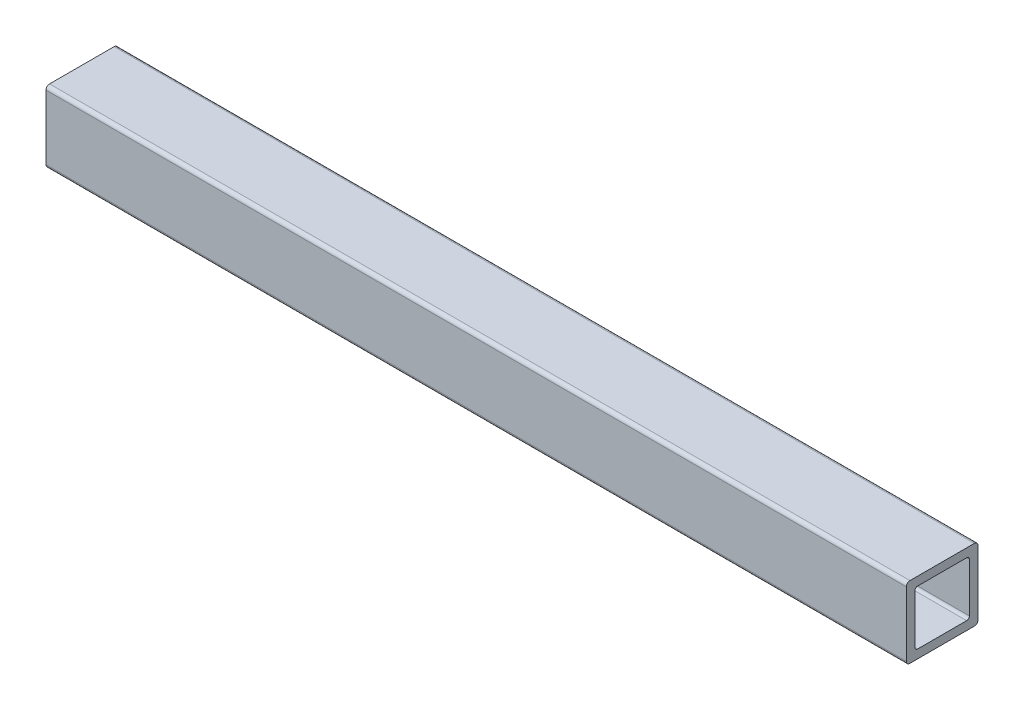
ISO-10303-21;
HEADER;
FILE_DESCRIPTION(('STEP AP214'),'2;1');
FILE_NAME('part.step','',(''),(''),'','','');
FILE_SCHEMA(('AUTOMOTIVE_DESIGN { 1 0 10303 214 1 1 1 1 }'));
ENDSEC;
DATA;
#1=APPLICATION_CONTEXT('core data for automotive mechanical design processes');
#2=APPLICATION_PROTOCOL_DEFINITION('international standard','automotive_design',2000,#1);
#3=PRODUCT_CONTEXT('',#1,'mechanical');
#4=PRODUCT('Part','Part','',(#3));
#5=PRODUCT_RELATED_PRODUCT_CATEGORY('part','',(#4));
#6=PRODUCT_DEFINITION_FORMATION('','',#4);
#7=PRODUCT_DEFINITION_CONTEXT('part definition',#1,'design');
#8=PRODUCT_DEFINITION('design','',#6,#7);
#9=PRODUCT_DEFINITION_SHAPE('','',#8);
#10=(LENGTH_UNIT() NAMED_UNIT(*) SI_UNIT(.MILLI.,.METRE.));
#11=(NAMED_UNIT(*) PLANE_ANGLE_UNIT() SI_UNIT($,.RADIAN.));
#12=(NAMED_UNIT(*) SI_UNIT($,.STERADIAN.) SOLID_ANGLE_UNIT());
#13=UNCERTAINTY_MEASURE_WITH_UNIT(LENGTH_MEASURE(1.E-05),#10,'distance_accuracy_value','');
#14=(GEOMETRIC_REPRESENTATION_CONTEXT(3) GLOBAL_UNCERTAINTY_ASSIGNED_CONTEXT((#13)) GLOBAL_UNIT_ASSIGNED_CONTEXT((#10,
#11,#12)) REPRESENTATION_CONTEXT('',''));
#15=CARTESIAN_POINT('',(0.,0.,0.));
#16=DIRECTION('',(0.,0.,1.));
#17=DIRECTION('',(1.,0.,0.));
#18=AXIS2_PLACEMENT_3D('',#15,#16,#17);
#19=CARTESIAN_POINT('',(152.4,-11.43,-11.43));
#20=DIRECTION('',(1.,0.,0.));
#21=DIRECTION('',(0.,0.,-1.));
#22=AXIS2_PLACEMENT_3D('',#19,#20,#21);
#23=PLANE('',#22);
#24=CARTESIAN_POINT('',(152.4,-11.43,-11.43));
#25=DIRECTION('',(1.,0.,0.));
#26=DIRECTION('',(0.,0.,-1.));
#27=AXIS2_PLACEMENT_3D('',#24,#25,#26);
#28=CIRCLE('',#27,1.27);
#29=CARTESIAN_POINT('',(152.4,-12.7,-11.43));
#30=VERTEX_POINT('',#29);
#31=CARTESIAN_POINT('',(152.4,-11.43,-12.7));
#32=VERTEX_POINT('',#31);
#33=EDGE_CURVE('E167',#30,#32,#28,.T.);
#34=ORIENTED_EDGE('',*,*,#33,.T.);
#35=DIRECTION('',(0.,1.,0.));
#36=VECTOR('',#35,1.);
#37=CARTESIAN_POINT('',(152.4,-11.43,-12.7));
#38=LINE('',#37,#36);
#39=CARTESIAN_POINT('',(152.4,11.43,-12.7));
#40=VERTEX_POINT('',#39);
#41=EDGE_CURVE('E282',#32,#40,#38,.T.);
#42=ORIENTED_EDGE('',*,*,#41,.T.);
#43=CARTESIAN_POINT('',(152.4,11.43,-11.43));
#44=DIRECTION('',(1.,0.,0.));
#45=DIRECTION('',(0.,0.,-1.));
#46=AXIS2_PLACEMENT_3D('',#43,#44,#45);
#47=CIRCLE('',#46,1.27);
#48=CARTESIAN_POINT('',(152.4,12.7,-11.43));
#49=VERTEX_POINT('',#48);
#50=EDGE_CURVE('E285',#40,#49,#47,.T.);
#51=ORIENTED_EDGE('',*,*,#50,.T.);
#52=DIRECTION('',(0.,0.,1.));
#53=VECTOR('',#52,1.);
#54=CARTESIAN_POINT('',(152.4,12.7,-11.43));
#55=LINE('',#54,#53);
#56=CARTESIAN_POINT('',(152.4,12.7,11.43));
#57=VERTEX_POINT('',#56);
#58=EDGE_CURVE('E288',#49,#57,#55,.T.);
#59=ORIENTED_EDGE('',*,*,#58,.T.);
#60=CARTESIAN_POINT('',(152.4,11.43,11.43));
#61=DIRECTION('',(1.,0.,0.));
#62=DIRECTION('',(0.,0.,-1.));
#63=AXIS2_PLACEMENT_3D('',#60,#61,#62);
#64=CIRCLE('',#63,1.27);
#65=CARTESIAN_POINT('',(152.4,11.43,12.7));
#66=VERTEX_POINT('',#65);
#67=EDGE_CURVE('E291',#57,#66,#64,.T.);
#68=ORIENTED_EDGE('',*,*,#67,.T.);
#69=DIRECTION('',(0.,-1.,0.));
#70=VECTOR('',#69,1.);
#71=CARTESIAN_POINT('',(152.4,-11.43,12.7));
#72=LINE('',#71,#70);
#73=CARTESIAN_POINT('',(152.4,-11.43,12.7));
#74=VERTEX_POINT('',#73);
#75=EDGE_CURVE('E294',#66,#74,#72,.T.);
#76=ORIENTED_EDGE('',*,*,#75,.T.);
#77=CARTESIAN_POINT('',(152.4,-11.43,11.43));
#78=DIRECTION('',(1.,0.,0.));
#79=DIRECTION('',(0.,0.,-1.));
#80=AXIS2_PLACEMENT_3D('',#77,#78,#79);
#81=CIRCLE('',#80,1.27);
#82=CARTESIAN_POINT('',(152.4,-12.7,11.43));
#83=VERTEX_POINT('',#82);
#84=EDGE_CURVE('E297',#74,#83,#81,.T.);
#85=ORIENTED_EDGE('',*,*,#84,.T.);
#86=DIRECTION('',(0.,0.,-1.));
#87=VECTOR('',#86,1.);
#88=CARTESIAN_POINT('',(152.4,-12.7,-11.43));
#89=LINE('',#88,#87);
#90=EDGE_CURVE('E65',#83,#30,#89,.T.);
#91=ORIENTED_EDGE('',*,*,#90,.T.);
#92=EDGE_LOOP('',(#34,#42,#51,#59,#68,#76,#85,#91));
#93=FACE_BOUND('',#92,.T.);
#94=DIRECTION('',(0.,0.,1.));
#95=VECTOR('',#94,1.);
#96=CARTESIAN_POINT('',(152.4,9.652,-8.6868));
#97=LINE('',#96,#95);
#98=CARTESIAN_POINT('',(152.4,9.652,-8.6868));
#99=VERTEX_POINT('',#98);
#100=CARTESIAN_POINT('',(152.4,9.652,8.6868));
#101=VERTEX_POINT('',#100);
#102=EDGE_CURVE('E240',#99,#101,#97,.T.);
#103=ORIENTED_EDGE('',*,*,#102,.F.);
#104=CARTESIAN_POINT('',(152.4,8.6868,-8.68679999999999));
#105=DIRECTION('',(1.,0.,0.));
#106=DIRECTION('',(0.,0.,-1.));
#107=AXIS2_PLACEMENT_3D('',#104,#105,#106);
#108=CIRCLE('',#107,0.9652);
#109=CARTESIAN_POINT('',(152.4,8.6868,-9.652));
#110=VERTEX_POINT('',#109);
#111=EDGE_CURVE('E163',#110,#99,#108,.T.);
#112=ORIENTED_EDGE('',*,*,#111,.F.);
#113=DIRECTION('',(0.,1.,0.));
#114=VECTOR('',#113,1.);
#115=CARTESIAN_POINT('',(152.4,8.6868,-9.652));
#116=LINE('',#115,#114);
#117=CARTESIAN_POINT('',(152.4,-8.6868,-9.652));
#118=VERTEX_POINT('',#117);
#119=EDGE_CURVE('E258',#118,#110,#116,.T.);
#120=ORIENTED_EDGE('',*,*,#119,.F.);
#121=CARTESIAN_POINT('',(152.4,-8.6868,-8.6868));
#122=DIRECTION('',(1.,0.,0.));
#123=DIRECTION('',(0.,0.,-1.));
#124=AXIS2_PLACEMENT_3D('',#121,#122,#123);
#125=CIRCLE('',#124,0.965199999999998);
#126=CARTESIAN_POINT('',(152.4,-9.652,-8.6868));
#127=VERTEX_POINT('',#126);
#128=EDGE_CURVE('E255',#127,#118,#125,.T.);
#129=ORIENTED_EDGE('',*,*,#128,.F.);
#130=DIRECTION('',(0.,0.,-1.));
#131=VECTOR('',#130,1.);
#132=CARTESIAN_POINT('',(152.4,-9.652,-8.6868));
#133=LINE('',#132,#131);
#134=CARTESIAN_POINT('',(152.4,-9.652,8.6868));
#135=VERTEX_POINT('',#134);
#136=EDGE_CURVE('E252',#135,#127,#133,.T.);
#137=ORIENTED_EDGE('',*,*,#136,.F.);
#138=CARTESIAN_POINT('',(152.4,-8.6868,8.68679999999999));
#139=DIRECTION('',(1.,0.,0.));
#140=DIRECTION('',(0.,0.,-1.));
#141=AXIS2_PLACEMENT_3D('',#138,#139,#140);
#142=CIRCLE('',#141,0.965200000000002);
#143=CARTESIAN_POINT('',(152.4,-8.6868,9.652));
#144=VERTEX_POINT('',#143);
#145=EDGE_CURVE('E249',#144,#135,#142,.T.);
#146=ORIENTED_EDGE('',*,*,#145,.F.);
#147=DIRECTION('',(0.,-1.,0.));
#148=VECTOR('',#147,1.);
#149=CARTESIAN_POINT('',(152.4,8.6868,9.652));
#150=LINE('',#149,#148);
#151=CARTESIAN_POINT('',(152.4,8.6868,9.652));
#152=VERTEX_POINT('',#151);
#153=EDGE_CURVE('E246',#152,#144,#150,.T.);
#154=ORIENTED_EDGE('',*,*,#153,.F.);
#155=CARTESIAN_POINT('',(152.4,8.6868,8.6868));
#156=DIRECTION('',(1.,0.,0.));
#157=DIRECTION('',(0.,0.,-1.));
#158=AXIS2_PLACEMENT_3D('',#155,#156,#157);
#159=CIRCLE('',#158,0.9652);
#160=EDGE_CURVE('E243',#101,#152,#159,.T.);
#161=ORIENTED_EDGE('',*,*,#160,.F.);
#162=EDGE_LOOP('',(#103,#112,#120,#129,#137,#146,#154,#161));
#163=FACE_BOUND('',#162,.T.);
#164=ADVANCED_FACE('F41',(#93,#163),#23,.T.);
#165=CARTESIAN_POINT('',(152.4,-11.43,-11.43));
#166=DIRECTION('',(-1.,0.,0.));
#167=DIRECTION('',(0.,0.,1.));
#168=AXIS2_PLACEMENT_3D('',#165,#166,#167);
#169=CYLINDRICAL_SURFACE('',#168,1.27);
#170=DIRECTION('',(-1.,0.,0.));
#171=VECTOR('',#170,1.);
#172=CARTESIAN_POINT('',(152.4,-12.7,-11.43));
#173=LINE('',#172,#171);
#174=CARTESIAN_POINT('',(-152.4,-12.7,-11.43));
#175=VERTEX_POINT('',#174);
#176=EDGE_CURVE('E302',#30,#175,#173,.T.);
#177=ORIENTED_EDGE('',*,*,#176,.T.);
#178=CARTESIAN_POINT('',(-152.4,-11.43,-11.43));
#179=DIRECTION('',(1.,0.,0.));
#180=DIRECTION('',(0.,0.,-1.));
#181=AXIS2_PLACEMENT_3D('',#178,#179,#180);
#182=CIRCLE('',#181,1.27);
#183=CARTESIAN_POINT('',(-152.4,-11.43,-12.7));
#184=VERTEX_POINT('',#183);
#185=EDGE_CURVE('E206',#175,#184,#182,.T.);
#186=ORIENTED_EDGE('',*,*,#185,.T.);
#187=DIRECTION('',(-1.,0.,0.));
#188=VECTOR('',#187,1.);
#189=CARTESIAN_POINT('',(152.4,-11.43,-12.7));
#190=LINE('',#189,#188);
#191=EDGE_CURVE('E11',#32,#184,#190,.T.);
#192=ORIENTED_EDGE('',*,*,#191,.F.);
#193=ORIENTED_EDGE('',*,*,#33,.F.);
#194=EDGE_LOOP('',(#177,#186,#192,#193));
#195=FACE_BOUND('',#194,.T.);
#196=ADVANCED_FACE('F43',(#195),#169,.T.);
#197=CARTESIAN_POINT('',(152.4,-11.43,-12.7));
#198=DIRECTION('',(0.,0.,1.));
#199=DIRECTION('',(1.,0.,0.));
#200=AXIS2_PLACEMENT_3D('',#197,#198,#199);
#201=PLANE('',#200);
#202=ORIENTED_EDGE('',*,*,#191,.T.);
#203=DIRECTION('',(0.,1.,0.));
#204=VECTOR('',#203,1.);
#205=CARTESIAN_POINT('',(-152.4,-11.43,-12.7));
#206=LINE('',#205,#204);
#207=CARTESIAN_POINT('',(-152.4,11.43,-12.7));
#208=VERTEX_POINT('',#207);
#209=EDGE_CURVE('E210',#184,#208,#206,.T.);
#210=ORIENTED_EDGE('',*,*,#209,.T.);
#211=DIRECTION('',(-1.,0.,0.));
#212=VECTOR('',#211,1.);
#213=CARTESIAN_POINT('',(152.4,11.43,-12.7));
#214=LINE('',#213,#212);
#215=EDGE_CURVE('E50',#40,#208,#214,.T.);
#216=ORIENTED_EDGE('',*,*,#215,.F.);
#217=ORIENTED_EDGE('',*,*,#41,.F.);
#218=EDGE_LOOP('',(#202,#210,#216,#217));
#219=FACE_BOUND('',#218,.T.);
#220=ADVANCED_FACE('F331',(#219),#201,.F.);
#221=CARTESIAN_POINT('',(152.4,11.43,-11.43));
#222=DIRECTION('',(-1.,0.,0.));
#223=DIRECTION('',(0.,0.,1.));
#224=AXIS2_PLACEMENT_3D('',#221,#222,#223);
#225=CYLINDRICAL_SURFACE('',#224,1.27);
#226=ORIENTED_EDGE('',*,*,#215,.T.);
#227=CARTESIAN_POINT('',(-152.4,11.43,-11.43));
#228=DIRECTION('',(1.,0.,0.));
#229=DIRECTION('',(0.,0.,-1.));
#230=AXIS2_PLACEMENT_3D('',#227,#228,#229);
#231=CIRCLE('',#230,1.27);
#232=CARTESIAN_POINT('',(-152.4,12.7,-11.43));
#233=VERTEX_POINT('',#232);
#234=EDGE_CURVE('E214',#208,#233,#231,.T.);
#235=ORIENTED_EDGE('',*,*,#234,.T.);
#236=DIRECTION('',(-1.,0.,0.));
#237=VECTOR('',#236,1.);
#238=CARTESIAN_POINT('',(152.4,12.7,-11.43));
#239=LINE('',#238,#237);
#240=EDGE_CURVE('E317',#49,#233,#239,.T.);
#241=ORIENTED_EDGE('',*,*,#240,.F.);
#242=ORIENTED_EDGE('',*,*,#50,.F.);
#243=EDGE_LOOP('',(#226,#235,#241,#242));
#244=FACE_BOUND('',#243,.T.);
#245=ADVANCED_FACE('F324',(#244),#225,.T.);
#246=CARTESIAN_POINT('',(152.4,12.7,-11.43));
#247=DIRECTION('',(0.,-1.,0.));
#248=DIRECTION('',(0.,0.,-1.));
#249=AXIS2_PLACEMENT_3D('',#246,#247,#248);
#250=PLANE('',#249);
#251=ORIENTED_EDGE('',*,*,#240,.T.);
#252=DIRECTION('',(0.,0.,1.));
#253=VECTOR('',#252,1.);
#254=CARTESIAN_POINT('',(-152.4,12.7,-11.43));
#255=LINE('',#254,#253);
#256=CARTESIAN_POINT('',(-152.4,12.7,11.43));
#257=VERTEX_POINT('',#256);
#258=EDGE_CURVE('E218',#233,#257,#255,.T.);
#259=ORIENTED_EDGE('',*,*,#258,.T.);
#260=DIRECTION('',(-1.,0.,0.));
#261=VECTOR('',#260,1.);
#262=CARTESIAN_POINT('',(152.4,12.7,11.43));
#263=LINE('',#262,#261);
#264=EDGE_CURVE('E314',#57,#257,#263,.T.);
#265=ORIENTED_EDGE('',*,*,#264,.F.);
#266=ORIENTED_EDGE('',*,*,#58,.F.);
#267=EDGE_LOOP('',(#251,#259,#265,#266));
#268=FACE_BOUND('',#267,.T.);
#269=ADVANCED_FACE('F354',(#268),#250,.F.);
#270=CARTESIAN_POINT('',(152.4,11.43,11.43));
#271=DIRECTION('',(-1.,0.,0.));
#272=DIRECTION('',(0.,0.,1.));
#273=AXIS2_PLACEMENT_3D('',#270,#271,#272);
#274=CYLINDRICAL_SURFACE('',#273,1.27);
#275=ORIENTED_EDGE('',*,*,#264,.T.);
#276=CARTESIAN_POINT('',(-152.4,11.43,11.43));
#277=DIRECTION('',(1.,0.,0.));
#278=DIRECTION('',(0.,0.,-1.));
#279=AXIS2_PLACEMENT_3D('',#276,#277,#278);
#280=CIRCLE('',#279,1.27);
#281=CARTESIAN_POINT('',(-152.4,11.43,12.7));
#282=VERTEX_POINT('',#281);
#283=EDGE_CURVE('E222',#257,#282,#280,.T.);
#284=ORIENTED_EDGE('',*,*,#283,.T.);
#285=DIRECTION('',(-1.,0.,0.));
#286=VECTOR('',#285,1.);
#287=CARTESIAN_POINT('',(152.4,11.43,12.7));
#288=LINE('',#287,#286);
#289=EDGE_CURVE('E311',#66,#282,#288,.T.);
#290=ORIENTED_EDGE('',*,*,#289,.F.);
#291=ORIENTED_EDGE('',*,*,#67,.F.);
#292=EDGE_LOOP('',(#275,#284,#290,#291));
#293=FACE_BOUND('',#292,.T.);
#294=ADVANCED_FACE('F351',(#293),#274,.T.);
#295=CARTESIAN_POINT('',(152.4,-11.43,12.7));
#296=DIRECTION('',(0.,0.,-1.));
#297=DIRECTION('',(-1.,0.,0.));
#298=AXIS2_PLACEMENT_3D('',#295,#296,#297);
#299=PLANE('',#298);
#300=ORIENTED_EDGE('',*,*,#289,.T.);
#301=DIRECTION('',(0.,-1.,0.));
#302=VECTOR('',#301,1.);
#303=CARTESIAN_POINT('',(-152.4,-11.43,12.7));
#304=LINE('',#303,#302);
#305=CARTESIAN_POINT('',(-152.4,-11.43,12.7));
#306=VERTEX_POINT('',#305);
#307=EDGE_CURVE('E226',#282,#306,#304,.T.);
#308=ORIENTED_EDGE('',*,*,#307,.T.);
#309=DIRECTION('',(-1.,0.,0.));
#310=VECTOR('',#309,1.);
#311=CARTESIAN_POINT('',(152.4,-11.43,12.7));
#312=LINE('',#311,#310);
#313=EDGE_CURVE('E308',#74,#306,#312,.T.);
#314=ORIENTED_EDGE('',*,*,#313,.F.);
#315=ORIENTED_EDGE('',*,*,#75,.F.);
#316=EDGE_LOOP('',(#300,#308,#314,#315));
#317=FACE_BOUND('',#316,.T.);
#318=ADVANCED_FACE('F346',(#317),#299,.F.);
#319=CARTESIAN_POINT('',(152.4,-11.43,11.43));
#320=DIRECTION('',(-1.,0.,0.));
#321=DIRECTION('',(0.,0.,1.));
#322=AXIS2_PLACEMENT_3D('',#319,#320,#321);
#323=CYLINDRICAL_SURFACE('',#322,1.27);
#324=ORIENTED_EDGE('',*,*,#313,.T.);
#325=CARTESIAN_POINT('',(-152.4,-11.43,11.43));
#326=DIRECTION('',(1.,0.,0.));
#327=DIRECTION('',(0.,0.,-1.));
#328=AXIS2_PLACEMENT_3D('',#325,#326,#327);
#329=CIRCLE('',#328,1.27);
#330=CARTESIAN_POINT('',(-152.4,-12.7,11.43));
#331=VERTEX_POINT('',#330);
#332=EDGE_CURVE('E230',#306,#331,#329,.T.);
#333=ORIENTED_EDGE('',*,*,#332,.T.);
#334=DIRECTION('',(-1.,0.,0.));
#335=VECTOR('',#334,1.);
#336=CARTESIAN_POINT('',(152.4,-12.7,11.43));
#337=LINE('',#336,#335);
#338=EDGE_CURVE('E305',#83,#331,#337,.T.);
#339=ORIENTED_EDGE('',*,*,#338,.F.);
#340=ORIENTED_EDGE('',*,*,#84,.F.);
#341=EDGE_LOOP('',(#324,#333,#339,#340));
#342=FACE_BOUND('',#341,.T.);
#343=ADVANCED_FACE('F342',(#342),#323,.T.);
#344=CARTESIAN_POINT('',(152.4,-12.7,-11.43));
#345=DIRECTION('',(0.,1.,0.));
#346=DIRECTION('',(0.,0.,1.));
#347=AXIS2_PLACEMENT_3D('',#344,#345,#346);
#348=PLANE('',#347);
#349=ORIENTED_EDGE('',*,*,#338,.T.);
#350=DIRECTION('',(0.,0.,-1.));
#351=VECTOR('',#350,1.);
#352=CARTESIAN_POINT('',(-152.4,-12.7,-11.43));
#353=LINE('',#352,#351);
#354=EDGE_CURVE('E234',#331,#175,#353,.T.);
#355=ORIENTED_EDGE('',*,*,#354,.T.);
#356=ORIENTED_EDGE('',*,*,#176,.F.);
#357=ORIENTED_EDGE('',*,*,#90,.F.);
#358=EDGE_LOOP('',(#349,#355,#356,#357));
#359=FACE_BOUND('',#358,.T.);
#360=ADVANCED_FACE('F338',(#359),#348,.F.);
#361=CARTESIAN_POINT('',(152.4,8.6868,-8.68679999999999));
#362=DIRECTION('',(-1.,0.,0.));
#363=DIRECTION('',(0.,0.,1.));
#364=AXIS2_PLACEMENT_3D('',#361,#362,#363);
#365=CYLINDRICAL_SURFACE('',#364,0.9652);
#366=DIRECTION('',(-1.,0.,0.));
#367=VECTOR('',#366,1.);
#368=CARTESIAN_POINT('',(152.4,9.652,-8.6868));
#369=LINE('',#368,#367);
#370=CARTESIAN_POINT('',(-152.4,9.652,-8.6868));
#371=VERTEX_POINT('',#370);
#372=EDGE_CURVE('E155',#99,#371,#369,.T.);
#373=ORIENTED_EDGE('',*,*,#372,.T.);
#374=CARTESIAN_POINT('',(-152.4,8.6868,-8.68679999999999));
#375=DIRECTION('',(1.,0.,0.));
#376=DIRECTION('',(0.,0.,-1.));
#377=AXIS2_PLACEMENT_3D('',#374,#375,#376);
#378=CIRCLE('',#377,0.9652);
#379=CARTESIAN_POINT('',(-152.4,8.6868,-9.652));
#380=VERTEX_POINT('',#379);
#381=EDGE_CURVE('E160',#380,#371,#378,.T.);
#382=ORIENTED_EDGE('',*,*,#381,.F.);
#383=DIRECTION('',(-1.,0.,0.));
#384=VECTOR('',#383,1.);
#385=CARTESIAN_POINT('',(152.4,8.6868,-9.652));
#386=LINE('',#385,#384);
#387=EDGE_CURVE('E261',#110,#380,#386,.T.);
#388=ORIENTED_EDGE('',*,*,#387,.F.);
#389=ORIENTED_EDGE('',*,*,#111,.T.);
#390=EDGE_LOOP('',(#373,#382,#388,#389));
#391=FACE_BOUND('',#390,.T.);
#392=ADVANCED_FACE('F157',(#391),#365,.F.);
#393=CARTESIAN_POINT('',(152.4,9.652,-8.6868));
#394=DIRECTION('',(0.,-1.,0.));
#395=DIRECTION('',(0.,0.,-1.));
#396=AXIS2_PLACEMENT_3D('',#393,#394,#395);
#397=PLANE('',#396);
#398=DIRECTION('',(-1.,0.,0.));
#399=VECTOR('',#398,1.);
#400=CARTESIAN_POINT('',(152.4,9.652,8.6868));
#401=LINE('',#400,#399);
#402=CARTESIAN_POINT('',(-152.4,9.652,8.68679999999999));
#403=VERTEX_POINT('',#402);
#404=EDGE_CURVE('E168',#101,#403,#401,.T.);
#405=ORIENTED_EDGE('',*,*,#404,.T.);
#406=DIRECTION('',(0.,0.,1.));
#407=VECTOR('',#406,1.);
#408=CARTESIAN_POINT('',(-152.4,9.652,-8.6868));
#409=LINE('',#408,#407);
#410=EDGE_CURVE('E171',#371,#403,#409,.T.);
#411=ORIENTED_EDGE('',*,*,#410,.F.);
#412=ORIENTED_EDGE('',*,*,#372,.F.);
#413=ORIENTED_EDGE('',*,*,#102,.T.);
#414=EDGE_LOOP('',(#405,#411,#412,#413));
#415=FACE_BOUND('',#414,.T.);
#416=ADVANCED_FACE('F172',(#415),#397,.T.);
#417=CARTESIAN_POINT('',(152.4,8.6868,8.6868));
#418=DIRECTION('',(-1.,0.,0.));
#419=DIRECTION('',(0.,0.,1.));
#420=AXIS2_PLACEMENT_3D('',#417,#418,#419);
#421=CYLINDRICAL_SURFACE('',#420,0.9652);
#422=DIRECTION('',(-1.,0.,0.));
#423=VECTOR('',#422,1.);
#424=CARTESIAN_POINT('',(152.4,8.6868,9.652));
#425=LINE('',#424,#423);
#426=CARTESIAN_POINT('',(-152.4,8.6868,9.652));
#427=VERTEX_POINT('',#426);
#428=EDGE_CURVE('E275',#152,#427,#425,.T.);
#429=ORIENTED_EDGE('',*,*,#428,.T.);
#430=CARTESIAN_POINT('',(-152.4,8.6868,8.6868));
#431=DIRECTION('',(1.,0.,0.));
#432=DIRECTION('',(0.,0.,-1.));
#433=AXIS2_PLACEMENT_3D('',#430,#431,#432);
#434=CIRCLE('',#433,0.9652);
#435=EDGE_CURVE('E178',#403,#427,#434,.T.);
#436=ORIENTED_EDGE('',*,*,#435,.F.);
#437=ORIENTED_EDGE('',*,*,#404,.F.);
#438=ORIENTED_EDGE('',*,*,#160,.T.);
#439=EDGE_LOOP('',(#429,#436,#437,#438));
#440=FACE_BOUND('',#439,.T.);
#441=ADVANCED_FACE('F363',(#440),#421,.F.);
#442=CARTESIAN_POINT('',(152.4,8.6868,9.652));
#443=DIRECTION('',(0.,0.,-1.));
#444=DIRECTION('',(0.,1.,0.));
#445=AXIS2_PLACEMENT_3D('',#442,#443,#444);
#446=PLANE('',#445);
#447=DIRECTION('',(-1.,0.,0.));
#448=VECTOR('',#447,1.);
#449=CARTESIAN_POINT('',(152.4,-8.6868,9.652));
#450=LINE('',#449,#448);
#451=CARTESIAN_POINT('',(-152.4,-8.6868,9.652));
#452=VERTEX_POINT('',#451);
#453=EDGE_CURVE('E272',#144,#452,#450,.T.);
#454=ORIENTED_EDGE('',*,*,#453,.T.);
#455=DIRECTION('',(0.,-1.,0.));
#456=VECTOR('',#455,1.);
#457=CARTESIAN_POINT('',(-152.4,8.6868,9.652));
#458=LINE('',#457,#456);
#459=EDGE_CURVE('E189',#427,#452,#458,.T.);
#460=ORIENTED_EDGE('',*,*,#459,.F.);
#461=ORIENTED_EDGE('',*,*,#428,.F.);
#462=ORIENTED_EDGE('',*,*,#153,.T.);
#463=EDGE_LOOP('',(#454,#460,#461,#462));
#464=FACE_BOUND('',#463,.T.);
#465=ADVANCED_FACE('F368',(#464),#446,.T.);
#466=CARTESIAN_POINT('',(152.4,-8.6868,8.68679999999999));
#467=DIRECTION('',(-1.,0.,0.));
#468=DIRECTION('',(0.,0.,1.));
#469=AXIS2_PLACEMENT_3D('',#466,#467,#468);
#470=CYLINDRICAL_SURFACE('',#469,0.965200000000002);
#471=DIRECTION('',(-1.,0.,0.));
#472=VECTOR('',#471,1.);
#473=CARTESIAN_POINT('',(152.4,-9.652,8.6868));
#474=LINE('',#473,#472);
#475=CARTESIAN_POINT('',(-152.4,-9.652,8.6868));
#476=VERTEX_POINT('',#475);
#477=EDGE_CURVE('E269',#135,#476,#474,.T.);
#478=ORIENTED_EDGE('',*,*,#477,.T.);
#479=CARTESIAN_POINT('',(-152.4,-8.6868,8.68679999999999));
#480=DIRECTION('',(1.,0.,0.));
#481=DIRECTION('',(0.,0.,-1.));
#482=AXIS2_PLACEMENT_3D('',#479,#480,#481);
#483=CIRCLE('',#482,0.965200000000002);
#484=EDGE_CURVE('E193',#452,#476,#483,.T.);
#485=ORIENTED_EDGE('',*,*,#484,.F.);
#486=ORIENTED_EDGE('',*,*,#453,.F.);
#487=ORIENTED_EDGE('',*,*,#145,.T.);
#488=EDGE_LOOP('',(#478,#485,#486,#487));
#489=FACE_BOUND('',#488,.T.);
#490=ADVANCED_FACE('F372',(#489),#470,.F.);
#491=CARTESIAN_POINT('',(152.4,-9.652,-8.6868));
#492=DIRECTION('',(0.,1.,0.));
#493=DIRECTION('',(0.,0.,1.));
#494=AXIS2_PLACEMENT_3D('',#491,#492,#493);
#495=PLANE('',#494);
#496=DIRECTION('',(-1.,0.,0.));
#497=VECTOR('',#496,1.);
#498=CARTESIAN_POINT('',(152.4,-9.652,-8.6868));
#499=LINE('',#498,#497);
#500=CARTESIAN_POINT('',(-152.4,-9.652,-8.6868));
#501=VERTEX_POINT('',#500);
#502=EDGE_CURVE('E266',#127,#501,#499,.T.);
#503=ORIENTED_EDGE('',*,*,#502,.T.);
#504=DIRECTION('',(0.,0.,-1.));
#505=VECTOR('',#504,1.);
#506=CARTESIAN_POINT('',(-152.4,-9.652,-8.6868));
#507=LINE('',#506,#505);
#508=EDGE_CURVE('E197',#476,#501,#507,.T.);
#509=ORIENTED_EDGE('',*,*,#508,.F.);
#510=ORIENTED_EDGE('',*,*,#477,.F.);
#511=ORIENTED_EDGE('',*,*,#136,.T.);
#512=EDGE_LOOP('',(#503,#509,#510,#511));
#513=FACE_BOUND('',#512,.T.);
#514=ADVANCED_FACE('F377',(#513),#495,.T.);
#515=CARTESIAN_POINT('',(152.4,-8.6868,-8.6868));
#516=DIRECTION('',(-1.,0.,0.));
#517=DIRECTION('',(0.,0.,1.));
#518=AXIS2_PLACEMENT_3D('',#515,#516,#517);
#519=CYLINDRICAL_SURFACE('',#518,0.965199999999998);
#520=DIRECTION('',(-1.,0.,0.));
#521=VECTOR('',#520,1.);
#522=CARTESIAN_POINT('',(152.4,-8.6868,-9.652));
#523=LINE('',#522,#521);
#524=CARTESIAN_POINT('',(-152.4,-8.6868,-9.652));
#525=VERTEX_POINT('',#524);
#526=EDGE_CURVE('E57',#118,#525,#523,.T.);
#527=ORIENTED_EDGE('',*,*,#526,.T.);
#528=CARTESIAN_POINT('',(-152.4,-8.6868,-8.6868));
#529=DIRECTION('',(1.,0.,0.));
#530=DIRECTION('',(0.,0.,-1.));
#531=AXIS2_PLACEMENT_3D('',#528,#529,#530);
#532=CIRCLE('',#531,0.965199999999998);
#533=EDGE_CURVE('E201',#501,#525,#532,.T.);
#534=ORIENTED_EDGE('',*,*,#533,.F.);
#535=ORIENTED_EDGE('',*,*,#502,.F.);
#536=ORIENTED_EDGE('',*,*,#128,.T.);
#537=EDGE_LOOP('',(#527,#534,#535,#536));
#538=FACE_BOUND('',#537,.T.);
#539=ADVANCED_FACE('F381',(#538),#519,.F.);
#540=CARTESIAN_POINT('',(152.4,8.6868,-9.652));
#541=DIRECTION('',(0.,0.,1.));
#542=DIRECTION('',(1.,0.,0.));
#543=AXIS2_PLACEMENT_3D('',#540,#541,#542);
#544=PLANE('',#543);
#545=ORIENTED_EDGE('',*,*,#387,.T.);
#546=DIRECTION('',(0.,1.,0.));
#547=VECTOR('',#546,1.);
#548=CARTESIAN_POINT('',(-152.4,8.6868,-9.652));
#549=LINE('',#548,#547);
#550=EDGE_CURVE('E183',#525,#380,#549,.T.);
#551=ORIENTED_EDGE('',*,*,#550,.F.);
#552=ORIENTED_EDGE('',*,*,#526,.F.);
#553=ORIENTED_EDGE('',*,*,#119,.T.);
#554=EDGE_LOOP('',(#545,#551,#552,#553));
#555=FACE_BOUND('',#554,.T.);
#556=ADVANCED_FACE('F383',(#555),#544,.T.);
#557=CARTESIAN_POINT('',(-152.4,-11.43,-11.43));
#558=DIRECTION('',(1.,0.,0.));
#559=DIRECTION('',(0.,0.,-1.));
#560=AXIS2_PLACEMENT_3D('',#557,#558,#559);
#561=PLANE('',#560);
#562=ORIENTED_EDGE('',*,*,#550,.T.);
#563=ORIENTED_EDGE('',*,*,#381,.T.);
#564=ORIENTED_EDGE('',*,*,#410,.T.);
#565=ORIENTED_EDGE('',*,*,#435,.T.);
#566=ORIENTED_EDGE('',*,*,#459,.T.);
#567=ORIENTED_EDGE('',*,*,#484,.T.);
#568=ORIENTED_EDGE('',*,*,#508,.T.);
#569=ORIENTED_EDGE('',*,*,#533,.T.);
#570=EDGE_LOOP('',(#562,#563,#564,#565,#566,#567,#568,#569));
#571=FACE_BOUND('',#570,.T.);
#572=ORIENTED_EDGE('',*,*,#185,.F.);
#573=ORIENTED_EDGE('',*,*,#354,.F.);
#574=ORIENTED_EDGE('',*,*,#332,.F.);
#575=ORIENTED_EDGE('',*,*,#307,.F.);
#576=ORIENTED_EDGE('',*,*,#283,.F.);
#577=ORIENTED_EDGE('',*,*,#258,.F.);
#578=ORIENTED_EDGE('',*,*,#234,.F.);
#579=ORIENTED_EDGE('',*,*,#209,.F.);
#580=EDGE_LOOP('',(#572,#573,#574,#575,#576,#577,#578,#579));
#581=FACE_BOUND('',#580,.T.);
#582=ADVANCED_FACE('F180',(#571,#581),#561,.F.);
#583=CLOSED_SHELL('',(#164,#196,#220,#245,#269,#294,#318,#343,#360,#392,#416,#441,#465,#490,
#514,#539,#556,#582));
#584=MANIFOLD_SOLID_BREP('B2',#583);
#585=ADVANCED_BREP_SHAPE_REPRESENTATION('',(#18,#584),#14);
#586=SHAPE_DEFINITION_REPRESENTATION(#9,#585);
ENDSEC;
END-ISO-10303-21;
